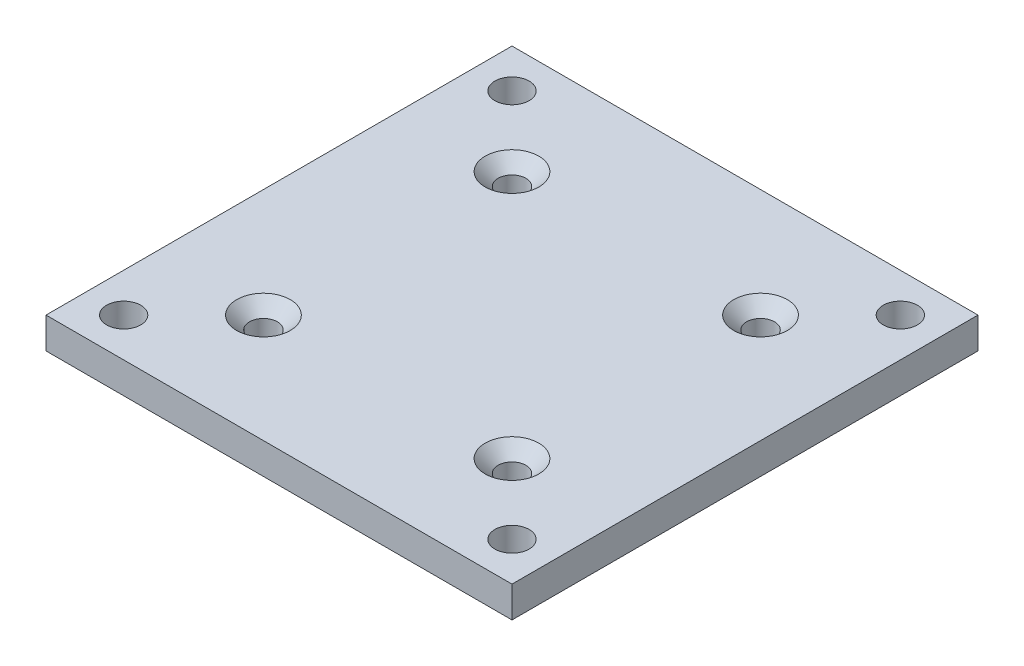
ISO-10303-21;
HEADER;
FILE_DESCRIPTION(('STEP AP214'),'2;1');
FILE_NAME('part.step','',(''),(''),'','','');
FILE_SCHEMA(('AUTOMOTIVE_DESIGN { 1 0 10303 214 1 1 1 1 }'));
ENDSEC;
DATA;
#1=APPLICATION_CONTEXT('core data for automotive mechanical design processes');
#2=APPLICATION_PROTOCOL_DEFINITION('international standard','automotive_design',2000,#1);
#3=PRODUCT_CONTEXT('',#1,'mechanical');
#4=PRODUCT('Part','Part','',(#3));
#5=PRODUCT_RELATED_PRODUCT_CATEGORY('part','',(#4));
#6=PRODUCT_DEFINITION_FORMATION('','',#4);
#7=PRODUCT_DEFINITION_CONTEXT('part definition',#1,'design');
#8=PRODUCT_DEFINITION('design','',#6,#7);
#9=PRODUCT_DEFINITION_SHAPE('','',#8);
#10=(LENGTH_UNIT() NAMED_UNIT(*) SI_UNIT(.MILLI.,.METRE.));
#11=(NAMED_UNIT(*) PLANE_ANGLE_UNIT() SI_UNIT($,.RADIAN.));
#12=(NAMED_UNIT(*) SI_UNIT($,.STERADIAN.) SOLID_ANGLE_UNIT());
#13=UNCERTAINTY_MEASURE_WITH_UNIT(LENGTH_MEASURE(1.E-05),#10,'distance_accuracy_value','');
#14=(GEOMETRIC_REPRESENTATION_CONTEXT(3) GLOBAL_UNCERTAINTY_ASSIGNED_CONTEXT((#13)) GLOBAL_UNIT_ASSIGNED_CONTEXT((#10,
#11,#12)) REPRESENTATION_CONTEXT('',''));
#15=CARTESIAN_POINT('',(0.,0.,0.));
#16=DIRECTION('',(0.,0.,1.));
#17=DIRECTION('',(1.,0.,0.));
#18=AXIS2_PLACEMENT_3D('',#15,#16,#17);
#19=CARTESIAN_POINT('',(0.,4.,0.));
#20=DIRECTION('',(0.,1.,0.));
#21=DIRECTION('',(0.,0.,1.));
#22=AXIS2_PLACEMENT_3D('',#19,#20,#21);
#23=PLANE('',#22);
#24=CARTESIAN_POINT('',(16.,4.,-16.0000000000051));
#25=DIRECTION('',(0.,1.,0.));
#26=DIRECTION('',(0.,0.,1.));
#27=AXIS2_PLACEMENT_3D('',#24,#25,#26);
#28=CIRCLE('',#27,3.45);
#29=CARTESIAN_POINT('',(16.,4.,-12.5500000000051));
#30=VERTEX_POINT('',#29);
#31=EDGE_CURVE('E204',#30,#30,#28,.T.);
#32=ORIENTED_EDGE('',*,*,#31,.F.);
#33=EDGE_LOOP('',(#32));
#34=FACE_BOUND('',#33,.T.);
#35=CARTESIAN_POINT('',(16.0000000000051,4.,15.9999999999949));
#36=DIRECTION('',(0.,1.,0.));
#37=DIRECTION('',(0.,0.,1.));
#38=AXIS2_PLACEMENT_3D('',#35,#36,#37);
#39=CIRCLE('',#38,3.45);
#40=CARTESIAN_POINT('',(16.0000000000051,4.,19.4499999999949));
#41=VERTEX_POINT('',#40);
#42=EDGE_CURVE('E192',#41,#41,#39,.T.);
#43=ORIENTED_EDGE('',*,*,#42,.F.);
#44=EDGE_LOOP('',(#43));
#45=FACE_BOUND('',#44,.T.);
#46=CARTESIAN_POINT('',(-15.9999999999949,4.,16.));
#47=DIRECTION('',(0.,1.,0.));
#48=DIRECTION('',(0.,0.,1.));
#49=AXIS2_PLACEMENT_3D('',#46,#47,#48);
#50=CIRCLE('',#49,3.45);
#51=CARTESIAN_POINT('',(-15.9999999999949,4.,19.45));
#52=VERTEX_POINT('',#51);
#53=EDGE_CURVE('E180',#52,#52,#50,.T.);
#54=ORIENTED_EDGE('',*,*,#53,.F.);
#55=EDGE_LOOP('',(#54));
#56=FACE_BOUND('',#55,.T.);
#57=CARTESIAN_POINT('',(-16.,4.,-16.));
#58=DIRECTION('',(0.,1.,0.));
#59=DIRECTION('',(0.,0.,1.));
#60=AXIS2_PLACEMENT_3D('',#57,#58,#59);
#61=CIRCLE('',#60,3.45);
#62=CARTESIAN_POINT('',(-16.,4.,-12.55));
#63=VERTEX_POINT('',#62);
#64=EDGE_CURVE('E168',#63,#63,#61,.T.);
#65=ORIENTED_EDGE('',*,*,#64,.F.);
#66=EDGE_LOOP('',(#65));
#67=FACE_BOUND('',#66,.T.);
#68=CARTESIAN_POINT('',(25.,4.,-25.0000000000051));
#69=DIRECTION('',(0.,1.,0.));
#70=DIRECTION('',(0.,0.,1.));
#71=AXIS2_PLACEMENT_3D('',#68,#69,#70);
#72=CIRCLE('',#71,2.20000000000453);
#73=CARTESIAN_POINT('',(25.,4.,-22.8000000000006));
#74=VERTEX_POINT('',#73);
#75=EDGE_CURVE('E149',#74,#74,#72,.T.);
#76=ORIENTED_EDGE('',*,*,#75,.F.);
#77=EDGE_LOOP('',(#76));
#78=FACE_BOUND('',#77,.T.);
#79=CARTESIAN_POINT('',(25.0000000000051,4.,24.9999999999949));
#80=DIRECTION('',(0.,1.,0.));
#81=DIRECTION('',(0.,0.,1.));
#82=AXIS2_PLACEMENT_3D('',#79,#80,#81);
#83=CIRCLE('',#82,2.20000000000612);
#84=CARTESIAN_POINT('',(25.0000000000051,4.,27.2000000000011));
#85=VERTEX_POINT('',#84);
#86=EDGE_CURVE('E141',#85,#85,#83,.T.);
#87=ORIENTED_EDGE('',*,*,#86,.F.);
#88=EDGE_LOOP('',(#87));
#89=FACE_BOUND('',#88,.T.);
#90=CARTESIAN_POINT('',(-24.9999999999949,4.,25.));
#91=DIRECTION('',(0.,1.,0.));
#92=DIRECTION('',(0.,0.,1.));
#93=AXIS2_PLACEMENT_3D('',#90,#91,#92);
#94=CIRCLE('',#93,2.20000000000138);
#95=CARTESIAN_POINT('',(-24.9999999999949,4.,27.2000000000014));
#96=VERTEX_POINT('',#95);
#97=EDGE_CURVE('E133',#96,#96,#94,.T.);
#98=ORIENTED_EDGE('',*,*,#97,.F.);
#99=EDGE_LOOP('',(#98));
#100=FACE_BOUND('',#99,.T.);
#101=CARTESIAN_POINT('',(-25.,4.,-25.));
#102=DIRECTION('',(0.,1.,0.));
#103=DIRECTION('',(0.,0.,1.));
#104=AXIS2_PLACEMENT_3D('',#101,#102,#103);
#105=CIRCLE('',#104,2.2);
#106=CARTESIAN_POINT('',(-25.,4.,-22.8));
#107=VERTEX_POINT('',#106);
#108=EDGE_CURVE('E111',#107,#107,#105,.T.);
#109=ORIENTED_EDGE('',*,*,#108,.F.);
#110=EDGE_LOOP('',(#109));
#111=FACE_BOUND('',#110,.T.);
#112=DIRECTION('',(0.,0.,1.));
#113=VECTOR('',#112,1.);
#114=CARTESIAN_POINT('',(-30.,4.,-30.));
#115=LINE('',#114,#113);
#116=CARTESIAN_POINT('',(-30.,4.,-30.));
#117=VERTEX_POINT('',#116);
#118=CARTESIAN_POINT('',(-30.,4.,30.));
#119=VERTEX_POINT('',#118);
#120=EDGE_CURVE('E91',#117,#119,#115,.T.);
#121=ORIENTED_EDGE('',*,*,#120,.T.);
#122=DIRECTION('',(1.,0.,0.));
#123=VECTOR('',#122,1.);
#124=CARTESIAN_POINT('',(-30.,4.,30.));
#125=LINE('',#124,#123);
#126=CARTESIAN_POINT('',(30.,4.,30.));
#127=VERTEX_POINT('',#126);
#128=EDGE_CURVE('E87',#119,#127,#125,.T.);
#129=ORIENTED_EDGE('',*,*,#128,.T.);
#130=DIRECTION('',(0.,0.,-1.));
#131=VECTOR('',#130,1.);
#132=CARTESIAN_POINT('',(30.,4.,-30.));
#133=LINE('',#132,#131);
#134=CARTESIAN_POINT('',(30.,4.,-30.));
#135=VERTEX_POINT('',#134);
#136=EDGE_CURVE('E89',#127,#135,#133,.T.);
#137=ORIENTED_EDGE('',*,*,#136,.T.);
#138=DIRECTION('',(-1.,0.,0.));
#139=VECTOR('',#138,1.);
#140=CARTESIAN_POINT('',(-30.,4.,-30.));
#141=LINE('',#140,#139);
#142=EDGE_CURVE('E57',#135,#117,#141,.T.);
#143=ORIENTED_EDGE('',*,*,#142,.T.);
#144=EDGE_LOOP('',(#121,#129,#137,#143));
#145=FACE_BOUND('',#144,.T.);
#146=ADVANCED_FACE('F39',(#34,#45,#56,#67,#78,#89,#100,#111,#145),#23,.T.);
#147=CARTESIAN_POINT('',(0.,0.,0.));
#148=DIRECTION('',(0.,1.,0.));
#149=DIRECTION('',(0.,0.,1.));
#150=AXIS2_PLACEMENT_3D('',#147,#148,#149);
#151=PLANE('',#150);
#152=CARTESIAN_POINT('',(16.,0.,-16.0000000000051));
#153=DIRECTION('',(0.,1.,0.));
#154=DIRECTION('',(0.,0.,1.));
#155=AXIS2_PLACEMENT_3D('',#152,#153,#154);
#156=CIRCLE('',#155,1.8);
#157=CARTESIAN_POINT('',(16.,0.,-14.2000000000051));
#158=VERTEX_POINT('',#157);
#159=EDGE_CURVE('E196',#158,#158,#156,.T.);
#160=ORIENTED_EDGE('',*,*,#159,.T.);
#161=EDGE_LOOP('',(#160));
#162=FACE_BOUND('',#161,.T.);
#163=CARTESIAN_POINT('',(16.0000000000051,0.,15.9999999999949));
#164=DIRECTION('',(0.,1.,0.));
#165=DIRECTION('',(0.,0.,1.));
#166=AXIS2_PLACEMENT_3D('',#163,#164,#165);
#167=CIRCLE('',#166,1.8);
#168=CARTESIAN_POINT('',(16.0000000000051,0.,17.7999999999949));
#169=VERTEX_POINT('',#168);
#170=EDGE_CURVE('E184',#169,#169,#167,.T.);
#171=ORIENTED_EDGE('',*,*,#170,.T.);
#172=EDGE_LOOP('',(#171));
#173=FACE_BOUND('',#172,.T.);
#174=CARTESIAN_POINT('',(-15.9999999999949,0.,16.));
#175=DIRECTION('',(0.,1.,0.));
#176=DIRECTION('',(0.,0.,1.));
#177=AXIS2_PLACEMENT_3D('',#174,#175,#176);
#178=CIRCLE('',#177,1.8);
#179=CARTESIAN_POINT('',(-15.9999999999949,0.,17.8));
#180=VERTEX_POINT('',#179);
#181=EDGE_CURVE('E172',#180,#180,#178,.T.);
#182=ORIENTED_EDGE('',*,*,#181,.T.);
#183=EDGE_LOOP('',(#182));
#184=FACE_BOUND('',#183,.T.);
#185=CARTESIAN_POINT('',(-16.,0.,-16.));
#186=DIRECTION('',(0.,1.,0.));
#187=DIRECTION('',(0.,0.,1.));
#188=AXIS2_PLACEMENT_3D('',#185,#186,#187);
#189=CIRCLE('',#188,1.8);
#190=CARTESIAN_POINT('',(-16.,0.,-14.2));
#191=VERTEX_POINT('',#190);
#192=EDGE_CURVE('E157',#191,#191,#189,.T.);
#193=ORIENTED_EDGE('',*,*,#192,.T.);
#194=EDGE_LOOP('',(#193));
#195=FACE_BOUND('',#194,.T.);
#196=DIRECTION('',(0.,0.,1.));
#197=VECTOR('',#196,1.);
#198=CARTESIAN_POINT('',(-30.,0.,-30.));
#199=LINE('',#198,#197);
#200=CARTESIAN_POINT('',(-30.,0.,-30.));
#201=VERTEX_POINT('',#200);
#202=CARTESIAN_POINT('',(-30.,0.,30.));
#203=VERTEX_POINT('',#202);
#204=EDGE_CURVE('E107',#201,#203,#199,.T.);
#205=ORIENTED_EDGE('',*,*,#204,.F.);
#206=DIRECTION('',(-1.,0.,0.));
#207=VECTOR('',#206,1.);
#208=CARTESIAN_POINT('',(-30.,0.,-30.));
#209=LINE('',#208,#207);
#210=CARTESIAN_POINT('',(30.,0.,-30.));
#211=VERTEX_POINT('',#210);
#212=EDGE_CURVE('E80',#211,#201,#209,.T.);
#213=ORIENTED_EDGE('',*,*,#212,.F.);
#214=DIRECTION('',(0.,0.,-1.));
#215=VECTOR('',#214,1.);
#216=CARTESIAN_POINT('',(30.,0.,-30.));
#217=LINE('',#216,#215);
#218=CARTESIAN_POINT('',(30.,0.,30.));
#219=VERTEX_POINT('',#218);
#220=EDGE_CURVE('E74',#219,#211,#217,.T.);
#221=ORIENTED_EDGE('',*,*,#220,.F.);
#222=DIRECTION('',(1.,0.,0.));
#223=VECTOR('',#222,1.);
#224=CARTESIAN_POINT('',(-30.,0.,30.));
#225=LINE('',#224,#223);
#226=EDGE_CURVE('E96',#203,#219,#225,.T.);
#227=ORIENTED_EDGE('',*,*,#226,.F.);
#228=EDGE_LOOP('',(#205,#213,#221,#227));
#229=FACE_BOUND('',#228,.T.);
#230=CARTESIAN_POINT('',(-25.,0.,-25.));
#231=DIRECTION('',(0.,1.,0.));
#232=DIRECTION('',(0.,0.,1.));
#233=AXIS2_PLACEMENT_3D('',#230,#231,#232);
#234=CIRCLE('',#233,2.2);
#235=CARTESIAN_POINT('',(-25.,0.,-22.8));
#236=VERTEX_POINT('',#235);
#237=EDGE_CURVE('E129',#236,#236,#234,.T.);
#238=ORIENTED_EDGE('',*,*,#237,.T.);
#239=EDGE_LOOP('',(#238));
#240=FACE_BOUND('',#239,.T.);
#241=CARTESIAN_POINT('',(-24.9999999999949,0.,25.));
#242=DIRECTION('',(0.,1.,0.));
#243=DIRECTION('',(0.,0.,1.));
#244=AXIS2_PLACEMENT_3D('',#241,#242,#243);
#245=CIRCLE('',#244,2.20000000000138);
#246=CARTESIAN_POINT('',(-24.9999999999949,0.,27.2000000000014));
#247=VERTEX_POINT('',#246);
#248=EDGE_CURVE('E137',#247,#247,#245,.T.);
#249=ORIENTED_EDGE('',*,*,#248,.T.);
#250=EDGE_LOOP('',(#249));
#251=FACE_BOUND('',#250,.T.);
#252=CARTESIAN_POINT('',(25.0000000000051,0.,24.9999999999949));
#253=DIRECTION('',(0.,1.,0.));
#254=DIRECTION('',(0.,0.,1.));
#255=AXIS2_PLACEMENT_3D('',#252,#253,#254);
#256=CIRCLE('',#255,2.20000000000612);
#257=CARTESIAN_POINT('',(25.0000000000051,0.,27.2000000000011));
#258=VERTEX_POINT('',#257);
#259=EDGE_CURVE('E145',#258,#258,#256,.T.);
#260=ORIENTED_EDGE('',*,*,#259,.T.);
#261=EDGE_LOOP('',(#260));
#262=FACE_BOUND('',#261,.T.);
#263=CARTESIAN_POINT('',(25.,0.,-25.0000000000051));
#264=DIRECTION('',(0.,1.,0.));
#265=DIRECTION('',(0.,0.,1.));
#266=AXIS2_PLACEMENT_3D('',#263,#264,#265);
#267=CIRCLE('',#266,2.20000000000453);
#268=CARTESIAN_POINT('',(25.,0.,-22.8000000000006));
#269=VERTEX_POINT('',#268);
#270=EDGE_CURVE('E153',#269,#269,#267,.T.);
#271=ORIENTED_EDGE('',*,*,#270,.T.);
#272=EDGE_LOOP('',(#271));
#273=FACE_BOUND('',#272,.T.);
#274=ADVANCED_FACE('F124',(#162,#173,#184,#195,#229,#240,#251,#262,#273),#151,.F.);
#275=CARTESIAN_POINT('',(-30.,4.,-30.));
#276=DIRECTION('',(1.,0.,0.));
#277=DIRECTION('',(0.,0.,-1.));
#278=AXIS2_PLACEMENT_3D('',#275,#276,#277);
#279=PLANE('',#278);
#280=ORIENTED_EDGE('',*,*,#204,.T.);
#281=DIRECTION('',(0.,-1.,0.));
#282=VECTOR('',#281,1.);
#283=CARTESIAN_POINT('',(-30.,4.,30.));
#284=LINE('',#283,#282);
#285=EDGE_CURVE('E11',#119,#203,#284,.T.);
#286=ORIENTED_EDGE('',*,*,#285,.F.);
#287=ORIENTED_EDGE('',*,*,#120,.F.);
#288=DIRECTION('',(0.,-1.,0.));
#289=VECTOR('',#288,1.);
#290=CARTESIAN_POINT('',(-30.,4.,-30.));
#291=LINE('',#290,#289);
#292=EDGE_CURVE('E103',#117,#201,#291,.T.);
#293=ORIENTED_EDGE('',*,*,#292,.T.);
#294=EDGE_LOOP('',(#280,#286,#287,#293));
#295=FACE_BOUND('',#294,.T.);
#296=ADVANCED_FACE('F41',(#295),#279,.F.);
#297=CARTESIAN_POINT('',(-30.,4.,30.));
#298=DIRECTION('',(0.,0.,-1.));
#299=DIRECTION('',(-1.,0.,0.));
#300=AXIS2_PLACEMENT_3D('',#297,#298,#299);
#301=PLANE('',#300);
#302=ORIENTED_EDGE('',*,*,#226,.T.);
#303=DIRECTION('',(0.,-1.,0.));
#304=VECTOR('',#303,1.);
#305=CARTESIAN_POINT('',(30.,4.,30.));
#306=LINE('',#305,#304);
#307=EDGE_CURVE('E49',#127,#219,#306,.T.);
#308=ORIENTED_EDGE('',*,*,#307,.F.);
#309=ORIENTED_EDGE('',*,*,#128,.F.);
#310=ORIENTED_EDGE('',*,*,#285,.T.);
#311=EDGE_LOOP('',(#302,#308,#309,#310));
#312=FACE_BOUND('',#311,.T.);
#313=ADVANCED_FACE('F95',(#312),#301,.F.);
#314=CARTESIAN_POINT('',(30.,4.,-30.));
#315=DIRECTION('',(-1.,0.,0.));
#316=DIRECTION('',(0.,0.,1.));
#317=AXIS2_PLACEMENT_3D('',#314,#315,#316);
#318=PLANE('',#317);
#319=ORIENTED_EDGE('',*,*,#220,.T.);
#320=DIRECTION('',(0.,-1.,0.));
#321=VECTOR('',#320,1.);
#322=CARTESIAN_POINT('',(30.,4.,-30.));
#323=LINE('',#322,#321);
#324=EDGE_CURVE('E98',#135,#211,#323,.T.);
#325=ORIENTED_EDGE('',*,*,#324,.F.);
#326=ORIENTED_EDGE('',*,*,#136,.F.);
#327=ORIENTED_EDGE('',*,*,#307,.T.);
#328=EDGE_LOOP('',(#319,#325,#326,#327));
#329=FACE_BOUND('',#328,.T.);
#330=ADVANCED_FACE('F99',(#329),#318,.F.);
#331=CARTESIAN_POINT('',(-30.,4.,-30.));
#332=DIRECTION('',(0.,0.,1.));
#333=DIRECTION('',(1.,0.,0.));
#334=AXIS2_PLACEMENT_3D('',#331,#332,#333);
#335=PLANE('',#334);
#336=ORIENTED_EDGE('',*,*,#212,.T.);
#337=ORIENTED_EDGE('',*,*,#292,.F.);
#338=ORIENTED_EDGE('',*,*,#142,.F.);
#339=ORIENTED_EDGE('',*,*,#324,.T.);
#340=EDGE_LOOP('',(#336,#337,#338,#339));
#341=FACE_BOUND('',#340,.T.);
#342=ADVANCED_FACE('F121',(#341),#335,.F.);
#343=CARTESIAN_POINT('',(-25.,4.,-25.));
#344=DIRECTION('',(0.,-1.,0.));
#345=DIRECTION('',(0.,0.,-1.));
#346=AXIS2_PLACEMENT_3D('',#343,#344,#345);
#347=CYLINDRICAL_SURFACE('',#346,2.2);
#348=ORIENTED_EDGE('',*,*,#108,.T.);
#349=EDGE_LOOP('',(#348));
#350=FACE_BOUND('',#349,.T.);
#351=ORIENTED_EDGE('',*,*,#237,.F.);
#352=EDGE_LOOP('',(#351));
#353=FACE_BOUND('',#352,.T.);
#354=ADVANCED_FACE('F228',(#350,#353),#347,.F.);
#355=CARTESIAN_POINT('',(-24.9999999999949,4.,25.));
#356=DIRECTION('',(0.,-1.,0.));
#357=DIRECTION('',(0.,0.,-1.));
#358=AXIS2_PLACEMENT_3D('',#355,#356,#357);
#359=CYLINDRICAL_SURFACE('',#358,2.20000000000138);
#360=ORIENTED_EDGE('',*,*,#97,.T.);
#361=EDGE_LOOP('',(#360));
#362=FACE_BOUND('',#361,.T.);
#363=ORIENTED_EDGE('',*,*,#248,.F.);
#364=EDGE_LOOP('',(#363));
#365=FACE_BOUND('',#364,.T.);
#366=ADVANCED_FACE('F231',(#362,#365),#359,.F.);
#367=CARTESIAN_POINT('',(25.0000000000051,4.,24.9999999999949));
#368=DIRECTION('',(0.,-1.,0.));
#369=DIRECTION('',(0.,0.,-1.));
#370=AXIS2_PLACEMENT_3D('',#367,#368,#369);
#371=CYLINDRICAL_SURFACE('',#370,2.20000000000612);
#372=ORIENTED_EDGE('',*,*,#86,.T.);
#373=EDGE_LOOP('',(#372));
#374=FACE_BOUND('',#373,.T.);
#375=ORIENTED_EDGE('',*,*,#259,.F.);
#376=EDGE_LOOP('',(#375));
#377=FACE_BOUND('',#376,.T.);
#378=ADVANCED_FACE('F247',(#374,#377),#371,.F.);
#379=CARTESIAN_POINT('',(25.,4.,-25.0000000000051));
#380=DIRECTION('',(0.,-1.,0.));
#381=DIRECTION('',(0.,0.,-1.));
#382=AXIS2_PLACEMENT_3D('',#379,#380,#381);
#383=CYLINDRICAL_SURFACE('',#382,2.20000000000453);
#384=ORIENTED_EDGE('',*,*,#75,.T.);
#385=EDGE_LOOP('',(#384));
#386=FACE_BOUND('',#385,.T.);
#387=ORIENTED_EDGE('',*,*,#270,.F.);
#388=EDGE_LOOP('',(#387));
#389=FACE_BOUND('',#388,.T.);
#390=ADVANCED_FACE('F244',(#386,#389),#383,.F.);
#391=CARTESIAN_POINT('',(-16.,4.,-16.));
#392=DIRECTION('',(0.,1.,0.));
#393=DIRECTION('',(0.,0.,1.));
#394=AXIS2_PLACEMENT_3D('',#391,#392,#393);
#395=CYLINDRICAL_SURFACE('',#394,1.8);
#396=ORIENTED_EDGE('',*,*,#192,.F.);
#397=EDGE_LOOP('',(#396));
#398=FACE_BOUND('',#397,.T.);
#399=CARTESIAN_POINT('',(-16.,2.35,-16.));
#400=DIRECTION('',(0.,1.,0.));
#401=DIRECTION('',(0.,0.,1.));
#402=AXIS2_PLACEMENT_3D('',#399,#400,#401);
#403=CIRCLE('',#402,1.8);
#404=CARTESIAN_POINT('',(-16.,2.35,-14.2));
#405=VERTEX_POINT('',#404);
#406=EDGE_CURVE('E164',#405,#405,#403,.T.);
#407=ORIENTED_EDGE('',*,*,#406,.T.);
#408=EDGE_LOOP('',(#407));
#409=FACE_BOUND('',#408,.T.);
#410=ADVANCED_FACE('F246',(#398,#409),#395,.F.);
#411=CARTESIAN_POINT('',(-16.,4.,-16.));
#412=DIRECTION('',(0.,1.,0.));
#413=DIRECTION('',(0.,0.,1.));
#414=AXIS2_PLACEMENT_3D('',#411,#412,#413);
#415=CONICAL_SURFACE('',#414,3.45,0.785398163397448);
#416=ORIENTED_EDGE('',*,*,#406,.F.);
#417=EDGE_LOOP('',(#416));
#418=FACE_BOUND('',#417,.T.);
#419=ORIENTED_EDGE('',*,*,#64,.T.);
#420=EDGE_LOOP('',(#419));
#421=FACE_BOUND('',#420,.T.);
#422=ADVANCED_FACE('F254',(#418,#421),#415,.F.);
#423=CARTESIAN_POINT('',(-15.9999999999949,4.,16.));
#424=DIRECTION('',(0.,1.,0.));
#425=DIRECTION('',(0.,0.,1.));
#426=AXIS2_PLACEMENT_3D('',#423,#424,#425);
#427=CYLINDRICAL_SURFACE('',#426,1.8);
#428=ORIENTED_EDGE('',*,*,#181,.F.);
#429=EDGE_LOOP('',(#428));
#430=FACE_BOUND('',#429,.T.);
#431=CARTESIAN_POINT('',(-15.9999999999949,2.35,16.));
#432=DIRECTION('',(0.,1.,0.));
#433=DIRECTION('',(0.,0.,1.));
#434=AXIS2_PLACEMENT_3D('',#431,#432,#433);
#435=CIRCLE('',#434,1.8);
#436=CARTESIAN_POINT('',(-15.9999999999949,2.35,17.8));
#437=VERTEX_POINT('',#436);
#438=EDGE_CURVE('E176',#437,#437,#435,.T.);
#439=ORIENTED_EDGE('',*,*,#438,.T.);
#440=EDGE_LOOP('',(#439));
#441=FACE_BOUND('',#440,.T.);
#442=ADVANCED_FACE('F338',(#430,#441),#427,.F.);
#443=CARTESIAN_POINT('',(-15.9999999999949,4.,16.));
#444=DIRECTION('',(0.,1.,0.));
#445=DIRECTION('',(0.,0.,1.));
#446=AXIS2_PLACEMENT_3D('',#443,#444,#445);
#447=CONICAL_SURFACE('',#446,3.45,0.785398163397448);
#448=ORIENTED_EDGE('',*,*,#438,.F.);
#449=EDGE_LOOP('',(#448));
#450=FACE_BOUND('',#449,.T.);
#451=ORIENTED_EDGE('',*,*,#53,.T.);
#452=EDGE_LOOP('',(#451));
#453=FACE_BOUND('',#452,.T.);
#454=ADVANCED_FACE('F346',(#450,#453),#447,.F.);
#455=CARTESIAN_POINT('',(16.0000000000051,4.,15.9999999999949));
#456=DIRECTION('',(0.,1.,0.));
#457=DIRECTION('',(0.,0.,1.));
#458=AXIS2_PLACEMENT_3D('',#455,#456,#457);
#459=CYLINDRICAL_SURFACE('',#458,1.8);
#460=ORIENTED_EDGE('',*,*,#170,.F.);
#461=EDGE_LOOP('',(#460));
#462=FACE_BOUND('',#461,.T.);
#463=CARTESIAN_POINT('',(16.0000000000051,2.35,15.9999999999949));
#464=DIRECTION('',(0.,1.,0.));
#465=DIRECTION('',(0.,0.,1.));
#466=AXIS2_PLACEMENT_3D('',#463,#464,#465);
#467=CIRCLE('',#466,1.8);
#468=CARTESIAN_POINT('',(16.0000000000051,2.35,17.7999999999949));
#469=VERTEX_POINT('',#468);
#470=EDGE_CURVE('E188',#469,#469,#467,.T.);
#471=ORIENTED_EDGE('',*,*,#470,.T.);
#472=EDGE_LOOP('',(#471));
#473=FACE_BOUND('',#472,.T.);
#474=ADVANCED_FACE('F355',(#462,#473),#459,.F.);
#475=CARTESIAN_POINT('',(16.0000000000051,4.,15.9999999999949));
#476=DIRECTION('',(0.,1.,0.));
#477=DIRECTION('',(0.,0.,1.));
#478=AXIS2_PLACEMENT_3D('',#475,#476,#477);
#479=CONICAL_SURFACE('',#478,3.45,0.785398163397449);
#480=ORIENTED_EDGE('',*,*,#470,.F.);
#481=EDGE_LOOP('',(#480));
#482=FACE_BOUND('',#481,.T.);
#483=ORIENTED_EDGE('',*,*,#42,.T.);
#484=EDGE_LOOP('',(#483));
#485=FACE_BOUND('',#484,.T.);
#486=ADVANCED_FACE('F364',(#482,#485),#479,.F.);
#487=CARTESIAN_POINT('',(16.,4.,-16.0000000000051));
#488=DIRECTION('',(0.,1.,0.));
#489=DIRECTION('',(0.,0.,1.));
#490=AXIS2_PLACEMENT_3D('',#487,#488,#489);
#491=CYLINDRICAL_SURFACE('',#490,1.8);
#492=ORIENTED_EDGE('',*,*,#159,.F.);
#493=EDGE_LOOP('',(#492));
#494=FACE_BOUND('',#493,.T.);
#495=CARTESIAN_POINT('',(16.,2.35,-16.0000000000051));
#496=DIRECTION('',(0.,1.,0.));
#497=DIRECTION('',(0.,0.,1.));
#498=AXIS2_PLACEMENT_3D('',#495,#496,#497);
#499=CIRCLE('',#498,1.8);
#500=CARTESIAN_POINT('',(16.,2.35,-14.2000000000051));
#501=VERTEX_POINT('',#500);
#502=EDGE_CURVE('E200',#501,#501,#499,.T.);
#503=ORIENTED_EDGE('',*,*,#502,.T.);
#504=EDGE_LOOP('',(#503));
#505=FACE_BOUND('',#504,.T.);
#506=ADVANCED_FACE('F373',(#494,#505),#491,.F.);
#507=CARTESIAN_POINT('',(16.,4.,-16.0000000000051));
#508=DIRECTION('',(0.,1.,0.));
#509=DIRECTION('',(0.,0.,1.));
#510=AXIS2_PLACEMENT_3D('',#507,#508,#509);
#511=CONICAL_SURFACE('',#510,3.45,0.785398163397449);
#512=ORIENTED_EDGE('',*,*,#502,.F.);
#513=EDGE_LOOP('',(#512));
#514=FACE_BOUND('',#513,.T.);
#515=ORIENTED_EDGE('',*,*,#31,.T.);
#516=EDGE_LOOP('',(#515));
#517=FACE_BOUND('',#516,.T.);
#518=ADVANCED_FACE('F209',(#514,#517),#511,.F.);
#519=CLOSED_SHELL('',(#146,#274,#296,#313,#330,#342,#354,#366,#378,#390,#410,#422,#442,#454,
#474,#486,#506,#518));
#520=MANIFOLD_SOLID_BREP('B2',#519);
#521=ADVANCED_BREP_SHAPE_REPRESENTATION('',(#18,#520),#14);
#522=SHAPE_DEFINITION_REPRESENTATION(#9,#521);
ENDSEC;
END-ISO-10303-21;
